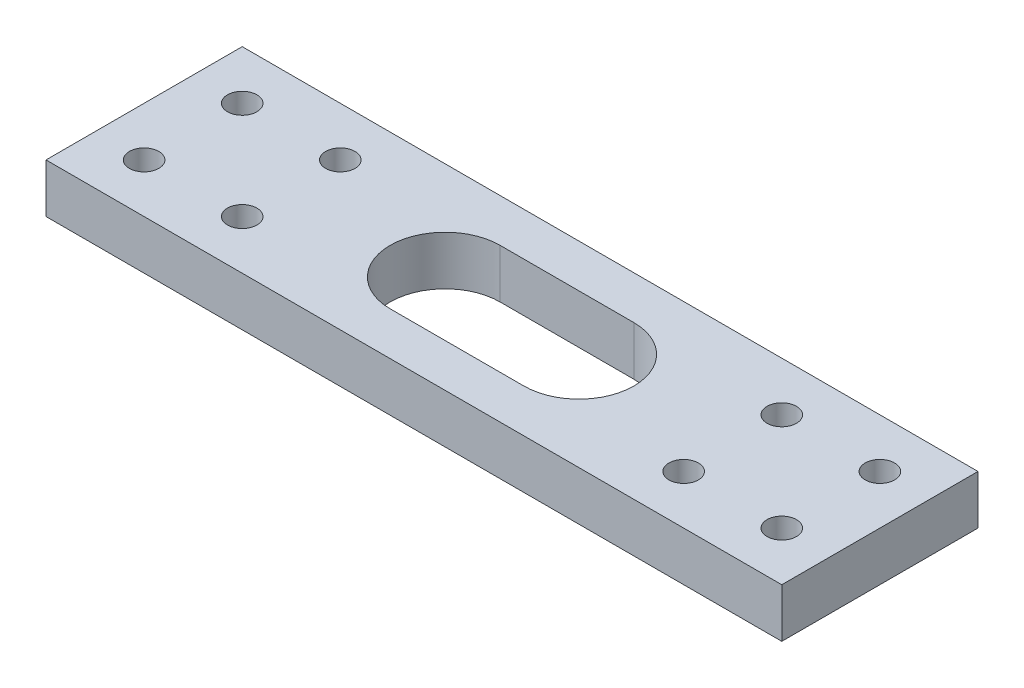
ISO-10303-21;
HEADER;
FILE_DESCRIPTION(('STEP AP214'),'2;1');
FILE_NAME('part.step','',(''),(''),'','','');
FILE_SCHEMA(('AUTOMOTIVE_DESIGN { 1 0 10303 214 1 1 1 1 }'));
ENDSEC;
DATA;
#1=APPLICATION_CONTEXT('core data for automotive mechanical design processes');
#2=APPLICATION_PROTOCOL_DEFINITION('international standard','automotive_design',2000,#1);
#3=PRODUCT_CONTEXT('',#1,'mechanical');
#4=PRODUCT('Part','Part','',(#3));
#5=PRODUCT_RELATED_PRODUCT_CATEGORY('part','',(#4));
#6=PRODUCT_DEFINITION_FORMATION('','',#4);
#7=PRODUCT_DEFINITION_CONTEXT('part definition',#1,'design');
#8=PRODUCT_DEFINITION('design','',#6,#7);
#9=PRODUCT_DEFINITION_SHAPE('','',#8);
#10=(LENGTH_UNIT() NAMED_UNIT(*) SI_UNIT(.MILLI.,.METRE.));
#11=(NAMED_UNIT(*) PLANE_ANGLE_UNIT() SI_UNIT($,.RADIAN.));
#12=(NAMED_UNIT(*) SI_UNIT($,.STERADIAN.) SOLID_ANGLE_UNIT());
#13=UNCERTAINTY_MEASURE_WITH_UNIT(LENGTH_MEASURE(1.E-05),#10,'distance_accuracy_value','');
#14=(GEOMETRIC_REPRESENTATION_CONTEXT(3) GLOBAL_UNCERTAINTY_ASSIGNED_CONTEXT((#13)) GLOBAL_UNIT_ASSIGNED_CONTEXT((#10,
#11,#12)) REPRESENTATION_CONTEXT('',''));
#15=CARTESIAN_POINT('',(0.,0.,0.));
#16=DIRECTION('',(0.,0.,1.));
#17=DIRECTION('',(1.,0.,0.));
#18=AXIS2_PLACEMENT_3D('',#15,#16,#17);
#19=CARTESIAN_POINT('',(37.5,5.,10.));
#20=DIRECTION('',(-1.,0.,0.));
#21=DIRECTION('',(0.,0.,1.));
#22=AXIS2_PLACEMENT_3D('',#19,#20,#21);
#23=PLANE('',#22);
#24=DIRECTION('',(0.,0.,-1.));
#25=VECTOR('',#24,1.);
#26=CARTESIAN_POINT('',(37.5,0.,10.));
#27=LINE('',#26,#25);
#28=CARTESIAN_POINT('',(37.5,0.,10.));
#29=VERTEX_POINT('',#28);
#30=CARTESIAN_POINT('',(37.5,0.,-10.));
#31=VERTEX_POINT('',#30);
#32=EDGE_CURVE('E185',#29,#31,#27,.T.);
#33=ORIENTED_EDGE('',*,*,#32,.T.);
#34=DIRECTION('',(0.,-1.,0.));
#35=VECTOR('',#34,1.);
#36=CARTESIAN_POINT('',(37.5,5.,-10.));
#37=LINE('',#36,#35);
#38=CARTESIAN_POINT('',(37.5,5.,-10.));
#39=VERTEX_POINT('',#38);
#40=EDGE_CURVE('E11',#39,#31,#37,.T.);
#41=ORIENTED_EDGE('',*,*,#40,.F.);
#42=DIRECTION('',(0.,0.,-1.));
#43=VECTOR('',#42,1.);
#44=CARTESIAN_POINT('',(37.5,5.,10.));
#45=LINE('',#44,#43);
#46=CARTESIAN_POINT('',(37.5,5.,10.));
#47=VERTEX_POINT('',#46);
#48=EDGE_CURVE('E189',#47,#39,#45,.T.);
#49=ORIENTED_EDGE('',*,*,#48,.F.);
#50=DIRECTION('',(0.,-1.,0.));
#51=VECTOR('',#50,1.);
#52=CARTESIAN_POINT('',(37.5,5.,10.));
#53=LINE('',#52,#51);
#54=EDGE_CURVE('E203',#47,#29,#53,.T.);
#55=ORIENTED_EDGE('',*,*,#54,.T.);
#56=EDGE_LOOP('',(#33,#41,#49,#55));
#57=FACE_BOUND('',#56,.T.);
#58=ADVANCED_FACE('F39',(#57),#23,.F.);
#59=CARTESIAN_POINT('',(-37.5,5.,-10.));
#60=DIRECTION('',(0.,0.,1.));
#61=DIRECTION('',(1.,0.,0.));
#62=AXIS2_PLACEMENT_3D('',#59,#60,#61);
#63=PLANE('',#62);
#64=DIRECTION('',(-1.,0.,0.));
#65=VECTOR('',#64,1.);
#66=CARTESIAN_POINT('',(-37.5,0.,-10.));
#67=LINE('',#66,#65);
#68=CARTESIAN_POINT('',(-37.5,0.,-10.));
#69=VERTEX_POINT('',#68);
#70=EDGE_CURVE('E207',#31,#69,#67,.T.);
#71=ORIENTED_EDGE('',*,*,#70,.T.);
#72=DIRECTION('',(0.,-1.,0.));
#73=VECTOR('',#72,1.);
#74=CARTESIAN_POINT('',(-37.5,5.,-10.));
#75=LINE('',#74,#73);
#76=CARTESIAN_POINT('',(-37.5,5.,-10.));
#77=VERTEX_POINT('',#76);
#78=EDGE_CURVE('E47',#77,#69,#75,.T.);
#79=ORIENTED_EDGE('',*,*,#78,.F.);
#80=DIRECTION('',(-1.,0.,0.));
#81=VECTOR('',#80,1.);
#82=CARTESIAN_POINT('',(-37.5,5.,-10.));
#83=LINE('',#82,#81);
#84=EDGE_CURVE('E193',#39,#77,#83,.T.);
#85=ORIENTED_EDGE('',*,*,#84,.F.);
#86=ORIENTED_EDGE('',*,*,#40,.T.);
#87=EDGE_LOOP('',(#71,#79,#85,#86));
#88=FACE_BOUND('',#87,.T.);
#89=ADVANCED_FACE('F242',(#88),#63,.F.);
#90=CARTESIAN_POINT('',(-37.5,5.,10.));
#91=DIRECTION('',(1.,0.,0.));
#92=DIRECTION('',(0.,0.,-1.));
#93=AXIS2_PLACEMENT_3D('',#90,#91,#92);
#94=PLANE('',#93);
#95=DIRECTION('',(0.,0.,1.));
#96=VECTOR('',#95,1.);
#97=CARTESIAN_POINT('',(-37.5,0.,10.));
#98=LINE('',#97,#96);
#99=CARTESIAN_POINT('',(-37.5,0.,10.));
#100=VERTEX_POINT('',#99);
#101=EDGE_CURVE('E210',#69,#100,#98,.T.);
#102=ORIENTED_EDGE('',*,*,#101,.T.);
#103=DIRECTION('',(0.,-1.,0.));
#104=VECTOR('',#103,1.);
#105=CARTESIAN_POINT('',(-37.5,5.,10.));
#106=LINE('',#105,#104);
#107=CARTESIAN_POINT('',(-37.5,5.,10.));
#108=VERTEX_POINT('',#107);
#109=EDGE_CURVE('E218',#108,#100,#106,.T.);
#110=ORIENTED_EDGE('',*,*,#109,.F.);
#111=DIRECTION('',(0.,0.,1.));
#112=VECTOR('',#111,1.);
#113=CARTESIAN_POINT('',(-37.5,5.,10.));
#114=LINE('',#113,#112);
#115=EDGE_CURVE('E197',#77,#108,#114,.T.);
#116=ORIENTED_EDGE('',*,*,#115,.F.);
#117=ORIENTED_EDGE('',*,*,#78,.T.);
#118=EDGE_LOOP('',(#102,#110,#116,#117));
#119=FACE_BOUND('',#118,.T.);
#120=ADVANCED_FACE('F227',(#119),#94,.F.);
#121=CARTESIAN_POINT('',(-37.5,5.,10.));
#122=DIRECTION('',(0.,0.,-1.));
#123=DIRECTION('',(-1.,0.,0.));
#124=AXIS2_PLACEMENT_3D('',#121,#122,#123);
#125=PLANE('',#124);
#126=DIRECTION('',(1.,0.,0.));
#127=VECTOR('',#126,1.);
#128=CARTESIAN_POINT('',(-37.5,0.,10.));
#129=LINE('',#128,#127);
#130=EDGE_CURVE('E194',#100,#29,#129,.T.);
#131=ORIENTED_EDGE('',*,*,#130,.T.);
#132=ORIENTED_EDGE('',*,*,#54,.F.);
#133=DIRECTION('',(1.,0.,0.));
#134=VECTOR('',#133,1.);
#135=CARTESIAN_POINT('',(-37.5,5.,10.));
#136=LINE('',#135,#134);
#137=EDGE_CURVE('E200',#108,#47,#136,.T.);
#138=ORIENTED_EDGE('',*,*,#137,.F.);
#139=ORIENTED_EDGE('',*,*,#109,.T.);
#140=EDGE_LOOP('',(#131,#132,#138,#139));
#141=FACE_BOUND('',#140,.T.);
#142=ADVANCED_FACE('F235',(#141),#125,.F.);
#143=CARTESIAN_POINT('',(0.,5.,0.));
#144=DIRECTION('',(0.,-1.,0.));
#145=DIRECTION('',(0.,0.,-1.));
#146=AXIS2_PLACEMENT_3D('',#143,#144,#145);
#147=PLANE('',#146);
#148=CARTESIAN_POINT('',(-32.5,5.,-5.));
#149=DIRECTION('',(0.,-1.,0.));
#150=DIRECTION('',(0.,0.,1.));
#151=AXIS2_PLACEMENT_3D('',#148,#149,#150);
#152=CIRCLE('',#151,1.5);
#153=CARTESIAN_POINT('',(-32.5,5.,-3.5));
#154=VERTEX_POINT('',#153);
#155=EDGE_CURVE('E320',#154,#154,#152,.T.);
#156=ORIENTED_EDGE('',*,*,#155,.T.);
#157=EDGE_LOOP('',(#156));
#158=FACE_BOUND('',#157,.T.);
#159=CARTESIAN_POINT('',(-22.5,5.,5.));
#160=DIRECTION('',(0.,-1.,0.));
#161=DIRECTION('',(0.,0.,1.));
#162=AXIS2_PLACEMENT_3D('',#159,#160,#161);
#163=CIRCLE('',#162,1.5);
#164=CARTESIAN_POINT('',(-22.5,5.,6.5));
#165=VERTEX_POINT('',#164);
#166=EDGE_CURVE('E313',#165,#165,#163,.T.);
#167=ORIENTED_EDGE('',*,*,#166,.T.);
#168=EDGE_LOOP('',(#167));
#169=FACE_BOUND('',#168,.T.);
#170=CARTESIAN_POINT('',(-32.5,5.,5.));
#171=DIRECTION('',(0.,-1.,0.));
#172=DIRECTION('',(0.,0.,1.));
#173=AXIS2_PLACEMENT_3D('',#170,#171,#172);
#174=CIRCLE('',#173,1.5);
#175=CARTESIAN_POINT('',(-32.5,5.,6.5));
#176=VERTEX_POINT('',#175);
#177=EDGE_CURVE('E308',#176,#176,#174,.T.);
#178=ORIENTED_EDGE('',*,*,#177,.T.);
#179=EDGE_LOOP('',(#178));
#180=FACE_BOUND('',#179,.T.);
#181=CARTESIAN_POINT('',(-22.5,5.,-5.));
#182=DIRECTION('',(0.,-1.,0.));
#183=DIRECTION('',(0.,0.,1.));
#184=AXIS2_PLACEMENT_3D('',#181,#182,#183);
#185=CIRCLE('',#184,1.5);
#186=CARTESIAN_POINT('',(-22.5,5.,-3.5));
#187=VERTEX_POINT('',#186);
#188=EDGE_CURVE('E132',#187,#187,#185,.T.);
#189=ORIENTED_EDGE('',*,*,#188,.T.);
#190=EDGE_LOOP('',(#189));
#191=FACE_BOUND('',#190,.T.);
#192=DIRECTION('',(-1.,0.,0.));
#193=VECTOR('',#192,1.);
#194=CARTESIAN_POINT('',(6.81829996968935,5.,-5.60229742732441));
#195=LINE('',#194,#193);
#196=CARTESIAN_POINT('',(6.81829996968935,5.,-5.60229742732441));
#197=VERTEX_POINT('',#196);
#198=CARTESIAN_POINT('',(-6.81829996968934,5.,-5.60229742732441));
#199=VERTEX_POINT('',#198);
#200=EDGE_CURVE('E141',#197,#199,#195,.T.);
#201=ORIENTED_EDGE('',*,*,#200,.F.);
#202=CARTESIAN_POINT('',(6.81829996968936,5.,0.));
#203=DIRECTION('',(0.,1.,0.));
#204=DIRECTION('',(0.,0.,1.));
#205=AXIS2_PLACEMENT_3D('',#202,#203,#204);
#206=CIRCLE('',#205,5.60229742732441);
#207=CARTESIAN_POINT('',(6.81829996968936,5.,5.60229742732441));
#208=VERTEX_POINT('',#207);
#209=EDGE_CURVE('E54',#208,#197,#206,.T.);
#210=ORIENTED_EDGE('',*,*,#209,.F.);
#211=DIRECTION('',(1.,0.,0.));
#212=VECTOR('',#211,1.);
#213=CARTESIAN_POINT('',(6.81829996968936,5.,5.60229742732441));
#214=LINE('',#213,#212);
#215=CARTESIAN_POINT('',(-6.81829996968934,5.,5.60229742732441));
#216=VERTEX_POINT('',#215);
#217=EDGE_CURVE('E125',#216,#208,#214,.T.);
#218=ORIENTED_EDGE('',*,*,#217,.F.);
#219=CARTESIAN_POINT('',(-6.81829996968934,5.,0.));
#220=DIRECTION('',(0.,1.,0.));
#221=DIRECTION('',(0.,0.,1.));
#222=AXIS2_PLACEMENT_3D('',#219,#220,#221);
#223=CIRCLE('',#222,5.60229742732441);
#224=EDGE_CURVE('E129',#199,#216,#223,.T.);
#225=ORIENTED_EDGE('',*,*,#224,.F.);
#226=EDGE_LOOP('',(#201,#210,#218,#225));
#227=FACE_BOUND('',#226,.T.);
#228=CARTESIAN_POINT('',(32.5,5.,-5.));
#229=DIRECTION('',(0.,1.,0.));
#230=DIRECTION('',(0.,0.,1.));
#231=AXIS2_PLACEMENT_3D('',#228,#229,#230);
#232=CIRCLE('',#231,1.5);
#233=CARTESIAN_POINT('',(32.5,5.,-3.5));
#234=VERTEX_POINT('',#233);
#235=EDGE_CURVE('E170',#234,#234,#232,.T.);
#236=ORIENTED_EDGE('',*,*,#235,.F.);
#237=EDGE_LOOP('',(#236));
#238=FACE_BOUND('',#237,.T.);
#239=CARTESIAN_POINT('',(22.5,5.,5.));
#240=DIRECTION('',(0.,1.,0.));
#241=DIRECTION('',(0.,0.,1.));
#242=AXIS2_PLACEMENT_3D('',#239,#240,#241);
#243=CIRCLE('',#242,1.5);
#244=CARTESIAN_POINT('',(22.5,5.,6.5));
#245=VERTEX_POINT('',#244);
#246=EDGE_CURVE('E161',#245,#245,#243,.T.);
#247=ORIENTED_EDGE('',*,*,#246,.F.);
#248=EDGE_LOOP('',(#247));
#249=FACE_BOUND('',#248,.T.);
#250=CARTESIAN_POINT('',(32.5,5.,5.));
#251=DIRECTION('',(0.,1.,0.));
#252=DIRECTION('',(0.,0.,1.));
#253=AXIS2_PLACEMENT_3D('',#250,#251,#252);
#254=CIRCLE('',#253,1.5);
#255=CARTESIAN_POINT('',(32.5,5.,6.5));
#256=VERTEX_POINT('',#255);
#257=EDGE_CURVE('E151',#256,#256,#254,.T.);
#258=ORIENTED_EDGE('',*,*,#257,.F.);
#259=EDGE_LOOP('',(#258));
#260=FACE_BOUND('',#259,.T.);
#261=CARTESIAN_POINT('',(22.5,5.,-5.));
#262=DIRECTION('',(0.,1.,0.));
#263=DIRECTION('',(0.,0.,1.));
#264=AXIS2_PLACEMENT_3D('',#261,#262,#263);
#265=CIRCLE('',#264,1.5);
#266=CARTESIAN_POINT('',(22.5,5.,-3.5));
#267=VERTEX_POINT('',#266);
#268=EDGE_CURVE('E169',#267,#267,#265,.T.);
#269=ORIENTED_EDGE('',*,*,#268,.F.);
#270=EDGE_LOOP('',(#269));
#271=FACE_BOUND('',#270,.T.);
#272=ORIENTED_EDGE('',*,*,#48,.T.);
#273=ORIENTED_EDGE('',*,*,#84,.T.);
#274=ORIENTED_EDGE('',*,*,#115,.T.);
#275=ORIENTED_EDGE('',*,*,#137,.T.);
#276=EDGE_LOOP('',(#272,#273,#274,#275));
#277=FACE_BOUND('',#276,.T.);
#278=ADVANCED_FACE('F241',(#158,#169,#180,#191,#227,#238,#249,#260,#271,#277),#147,.F.);
#279=CARTESIAN_POINT('',(0.,0.,0.));
#280=DIRECTION('',(0.,-1.,0.));
#281=DIRECTION('',(0.,0.,-1.));
#282=AXIS2_PLACEMENT_3D('',#279,#280,#281);
#283=PLANE('',#282);
#284=CARTESIAN_POINT('',(-32.5,0.,-5.));
#285=DIRECTION('',(0.,-1.,0.));
#286=DIRECTION('',(0.,0.,1.));
#287=AXIS2_PLACEMENT_3D('',#284,#285,#286);
#288=CIRCLE('',#287,1.5);
#289=CARTESIAN_POINT('',(-32.5,0.,-3.5));
#290=VERTEX_POINT('',#289);
#291=EDGE_CURVE('E316',#290,#290,#288,.T.);
#292=ORIENTED_EDGE('',*,*,#291,.F.);
#293=EDGE_LOOP('',(#292));
#294=FACE_BOUND('',#293,.T.);
#295=CARTESIAN_POINT('',(-22.5,0.,5.));
#296=DIRECTION('',(0.,-1.,0.));
#297=DIRECTION('',(0.,0.,1.));
#298=AXIS2_PLACEMENT_3D('',#295,#296,#297);
#299=CIRCLE('',#298,1.5);
#300=CARTESIAN_POINT('',(-22.5,0.,6.5));
#301=VERTEX_POINT('',#300);
#302=EDGE_CURVE('E324',#301,#301,#299,.T.);
#303=ORIENTED_EDGE('',*,*,#302,.F.);
#304=EDGE_LOOP('',(#303));
#305=FACE_BOUND('',#304,.T.);
#306=CARTESIAN_POINT('',(-32.5,0.,5.));
#307=DIRECTION('',(0.,-1.,0.));
#308=DIRECTION('',(0.,0.,1.));
#309=AXIS2_PLACEMENT_3D('',#306,#307,#308);
#310=CIRCLE('',#309,1.5);
#311=CARTESIAN_POINT('',(-32.5,0.,6.5));
#312=VERTEX_POINT('',#311);
#313=EDGE_CURVE('E305',#312,#312,#310,.T.);
#314=ORIENTED_EDGE('',*,*,#313,.F.);
#315=EDGE_LOOP('',(#314));
#316=FACE_BOUND('',#315,.T.);
#317=CARTESIAN_POINT('',(-22.5,0.,-5.));
#318=DIRECTION('',(0.,-1.,0.));
#319=DIRECTION('',(0.,0.,1.));
#320=AXIS2_PLACEMENT_3D('',#317,#318,#319);
#321=CIRCLE('',#320,1.5);
#322=CARTESIAN_POINT('',(-22.5,0.,-3.5));
#323=VERTEX_POINT('',#322);
#324=EDGE_CURVE('E142',#323,#323,#321,.T.);
#325=ORIENTED_EDGE('',*,*,#324,.F.);
#326=EDGE_LOOP('',(#325));
#327=FACE_BOUND('',#326,.T.);
#328=CARTESIAN_POINT('',(6.81829996968936,0.,0.));
#329=DIRECTION('',(0.,1.,0.));
#330=DIRECTION('',(0.,0.,1.));
#331=AXIS2_PLACEMENT_3D('',#328,#329,#330);
#332=CIRCLE('',#331,5.60229742732441);
#333=CARTESIAN_POINT('',(6.81829996968936,0.,5.60229742732441));
#334=VERTEX_POINT('',#333);
#335=CARTESIAN_POINT('',(6.81829996968935,0.,-5.60229742732441));
#336=VERTEX_POINT('',#335);
#337=EDGE_CURVE('E106',#334,#336,#332,.T.);
#338=ORIENTED_EDGE('',*,*,#337,.T.);
#339=DIRECTION('',(-1.,0.,0.));
#340=VECTOR('',#339,1.);
#341=CARTESIAN_POINT('',(6.81829996968935,0.,-5.60229742732441));
#342=LINE('',#341,#340);
#343=CARTESIAN_POINT('',(-6.81829996968934,0.,-5.60229742732441));
#344=VERTEX_POINT('',#343);
#345=EDGE_CURVE('E116',#336,#344,#342,.T.);
#346=ORIENTED_EDGE('',*,*,#345,.T.);
#347=CARTESIAN_POINT('',(-6.81829996968934,0.,0.));
#348=DIRECTION('',(0.,1.,0.));
#349=DIRECTION('',(0.,0.,1.));
#350=AXIS2_PLACEMENT_3D('',#347,#348,#349);
#351=CIRCLE('',#350,5.60229742732441);
#352=CARTESIAN_POINT('',(-6.81829996968934,0.,5.60229742732441));
#353=VERTEX_POINT('',#352);
#354=EDGE_CURVE('E62',#344,#353,#351,.T.);
#355=ORIENTED_EDGE('',*,*,#354,.T.);
#356=DIRECTION('',(1.,0.,0.));
#357=VECTOR('',#356,1.);
#358=CARTESIAN_POINT('',(6.81829996968936,0.,5.60229742732441));
#359=LINE('',#358,#357);
#360=EDGE_CURVE('E113',#353,#334,#359,.T.);
#361=ORIENTED_EDGE('',*,*,#360,.T.);
#362=EDGE_LOOP('',(#338,#346,#355,#361));
#363=FACE_BOUND('',#362,.T.);
#364=CARTESIAN_POINT('',(32.5,0.,-5.));
#365=DIRECTION('',(0.,1.,0.));
#366=DIRECTION('',(0.,0.,1.));
#367=AXIS2_PLACEMENT_3D('',#364,#365,#366);
#368=CIRCLE('',#367,1.5);
#369=CARTESIAN_POINT('',(32.5,0.,-3.5));
#370=VERTEX_POINT('',#369);
#371=EDGE_CURVE('E165',#370,#370,#368,.T.);
#372=ORIENTED_EDGE('',*,*,#371,.T.);
#373=EDGE_LOOP('',(#372));
#374=FACE_BOUND('',#373,.T.);
#375=CARTESIAN_POINT('',(22.5,0.,5.));
#376=DIRECTION('',(0.,1.,0.));
#377=DIRECTION('',(0.,0.,1.));
#378=AXIS2_PLACEMENT_3D('',#375,#376,#377);
#379=CIRCLE('',#378,1.5);
#380=CARTESIAN_POINT('',(22.5,0.,6.5));
#381=VERTEX_POINT('',#380);
#382=EDGE_CURVE('E174',#381,#381,#379,.T.);
#383=ORIENTED_EDGE('',*,*,#382,.T.);
#384=EDGE_LOOP('',(#383));
#385=FACE_BOUND('',#384,.T.);
#386=CARTESIAN_POINT('',(32.5,0.,5.));
#387=DIRECTION('',(0.,1.,0.));
#388=DIRECTION('',(0.,0.,1.));
#389=AXIS2_PLACEMENT_3D('',#386,#387,#388);
#390=CIRCLE('',#389,1.5);
#391=CARTESIAN_POINT('',(32.5,0.,6.5));
#392=VERTEX_POINT('',#391);
#393=EDGE_CURVE('E157',#392,#392,#390,.T.);
#394=ORIENTED_EDGE('',*,*,#393,.T.);
#395=EDGE_LOOP('',(#394));
#396=FACE_BOUND('',#395,.T.);
#397=CARTESIAN_POINT('',(22.5,0.,-5.));
#398=DIRECTION('',(0.,1.,0.));
#399=DIRECTION('',(0.,0.,1.));
#400=AXIS2_PLACEMENT_3D('',#397,#398,#399);
#401=CIRCLE('',#400,1.5);
#402=CARTESIAN_POINT('',(22.5,0.,-3.5));
#403=VERTEX_POINT('',#402);
#404=EDGE_CURVE('E181',#403,#403,#401,.T.);
#405=ORIENTED_EDGE('',*,*,#404,.T.);
#406=EDGE_LOOP('',(#405));
#407=FACE_BOUND('',#406,.T.);
#408=ORIENTED_EDGE('',*,*,#32,.F.);
#409=ORIENTED_EDGE('',*,*,#130,.F.);
#410=ORIENTED_EDGE('',*,*,#101,.F.);
#411=ORIENTED_EDGE('',*,*,#70,.F.);
#412=EDGE_LOOP('',(#408,#409,#410,#411));
#413=FACE_BOUND('',#412,.T.);
#414=ADVANCED_FACE('F121',(#294,#305,#316,#327,#363,#374,#385,#396,#407,#413),#283,.T.);
#415=CARTESIAN_POINT('',(22.5,0.,-5.));
#416=DIRECTION('',(0.,1.,0.));
#417=DIRECTION('',(0.,0.,1.));
#418=AXIS2_PLACEMENT_3D('',#415,#416,#417);
#419=CYLINDRICAL_SURFACE('',#418,1.5);
#420=ORIENTED_EDGE('',*,*,#404,.F.);
#421=EDGE_LOOP('',(#420));
#422=FACE_BOUND('',#421,.T.);
#423=ORIENTED_EDGE('',*,*,#268,.T.);
#424=EDGE_LOOP('',(#423));
#425=FACE_BOUND('',#424,.T.);
#426=ADVANCED_FACE('F254',(#422,#425),#419,.F.);
#427=CARTESIAN_POINT('',(32.5,0.,5.));
#428=DIRECTION('',(0.,1.,0.));
#429=DIRECTION('',(0.,0.,1.));
#430=AXIS2_PLACEMENT_3D('',#427,#428,#429);
#431=CYLINDRICAL_SURFACE('',#430,1.5);
#432=ORIENTED_EDGE('',*,*,#393,.F.);
#433=EDGE_LOOP('',(#432));
#434=FACE_BOUND('',#433,.T.);
#435=ORIENTED_EDGE('',*,*,#257,.T.);
#436=EDGE_LOOP('',(#435));
#437=FACE_BOUND('',#436,.T.);
#438=ADVANCED_FACE('F261',(#434,#437),#431,.F.);
#439=CARTESIAN_POINT('',(22.5,0.,5.));
#440=DIRECTION('',(0.,1.,0.));
#441=DIRECTION('',(0.,0.,1.));
#442=AXIS2_PLACEMENT_3D('',#439,#440,#441);
#443=CYLINDRICAL_SURFACE('',#442,1.5);
#444=ORIENTED_EDGE('',*,*,#382,.F.);
#445=EDGE_LOOP('',(#444));
#446=FACE_BOUND('',#445,.T.);
#447=ORIENTED_EDGE('',*,*,#246,.T.);
#448=EDGE_LOOP('',(#447));
#449=FACE_BOUND('',#448,.T.);
#450=ADVANCED_FACE('F263',(#446,#449),#443,.F.);
#451=CARTESIAN_POINT('',(32.5,0.,-5.));
#452=DIRECTION('',(0.,1.,0.));
#453=DIRECTION('',(0.,0.,1.));
#454=AXIS2_PLACEMENT_3D('',#451,#452,#453);
#455=CYLINDRICAL_SURFACE('',#454,1.5);
#456=ORIENTED_EDGE('',*,*,#371,.F.);
#457=EDGE_LOOP('',(#456));
#458=FACE_BOUND('',#457,.T.);
#459=ORIENTED_EDGE('',*,*,#235,.T.);
#460=EDGE_LOOP('',(#459));
#461=FACE_BOUND('',#460,.T.);
#462=ADVANCED_FACE('F266',(#458,#461),#455,.F.);
#463=CARTESIAN_POINT('',(6.81829996968936,0.,0.));
#464=DIRECTION('',(0.,1.,0.));
#465=DIRECTION('',(0.,0.,1.));
#466=AXIS2_PLACEMENT_3D('',#463,#464,#465);
#467=CYLINDRICAL_SURFACE('',#466,5.60229742732441);
#468=ORIENTED_EDGE('',*,*,#209,.T.);
#469=DIRECTION('',(0.,1.,0.));
#470=VECTOR('',#469,1.);
#471=CARTESIAN_POINT('',(6.81829996968935,0.,-5.60229742732441));
#472=LINE('',#471,#470);
#473=EDGE_CURVE('E102',#336,#197,#472,.T.);
#474=ORIENTED_EDGE('',*,*,#473,.F.);
#475=ORIENTED_EDGE('',*,*,#337,.F.);
#476=DIRECTION('',(0.,1.,0.));
#477=VECTOR('',#476,1.);
#478=CARTESIAN_POINT('',(6.81829996968936,0.,5.60229742732441));
#479=LINE('',#478,#477);
#480=EDGE_CURVE('E148',#334,#208,#479,.T.);
#481=ORIENTED_EDGE('',*,*,#480,.T.);
#482=EDGE_LOOP('',(#468,#474,#475,#481));
#483=FACE_BOUND('',#482,.T.);
#484=ADVANCED_FACE('F104',(#483),#467,.F.);
#485=CARTESIAN_POINT('',(6.81829996968936,0.,5.60229742732441));
#486=DIRECTION('',(0.,0.,1.));
#487=DIRECTION('',(1.,0.,0.));
#488=AXIS2_PLACEMENT_3D('',#485,#486,#487);
#489=PLANE('',#488);
#490=ORIENTED_EDGE('',*,*,#217,.T.);
#491=ORIENTED_EDGE('',*,*,#480,.F.);
#492=ORIENTED_EDGE('',*,*,#360,.F.);
#493=DIRECTION('',(0.,1.,0.));
#494=VECTOR('',#493,1.);
#495=CARTESIAN_POINT('',(-6.81829996968934,0.,5.60229742732441));
#496=LINE('',#495,#494);
#497=EDGE_CURVE('E152',#353,#216,#496,.T.);
#498=ORIENTED_EDGE('',*,*,#497,.T.);
#499=EDGE_LOOP('',(#490,#491,#492,#498));
#500=FACE_BOUND('',#499,.T.);
#501=ADVANCED_FACE('F276',(#500),#489,.F.);
#502=CARTESIAN_POINT('',(-6.81829996968934,0.,0.));
#503=DIRECTION('',(0.,1.,0.));
#504=DIRECTION('',(0.,0.,1.));
#505=AXIS2_PLACEMENT_3D('',#502,#503,#504);
#506=CYLINDRICAL_SURFACE('',#505,5.60229742732441);
#507=ORIENTED_EDGE('',*,*,#224,.T.);
#508=ORIENTED_EDGE('',*,*,#497,.F.);
#509=ORIENTED_EDGE('',*,*,#354,.F.);
#510=DIRECTION('',(0.,1.,0.));
#511=VECTOR('',#510,1.);
#512=CARTESIAN_POINT('',(-6.81829996968934,0.,-5.60229742732441));
#513=LINE('',#512,#511);
#514=EDGE_CURVE('E112',#344,#199,#513,.T.);
#515=ORIENTED_EDGE('',*,*,#514,.T.);
#516=EDGE_LOOP('',(#507,#508,#509,#515));
#517=FACE_BOUND('',#516,.T.);
#518=ADVANCED_FACE('F280',(#517),#506,.F.);
#519=CARTESIAN_POINT('',(6.81829996968935,0.,-5.60229742732441));
#520=DIRECTION('',(0.,0.,-1.));
#521=DIRECTION('',(-1.,0.,0.));
#522=AXIS2_PLACEMENT_3D('',#519,#520,#521);
#523=PLANE('',#522);
#524=ORIENTED_EDGE('',*,*,#200,.T.);
#525=ORIENTED_EDGE('',*,*,#514,.F.);
#526=ORIENTED_EDGE('',*,*,#345,.F.);
#527=ORIENTED_EDGE('',*,*,#473,.T.);
#528=EDGE_LOOP('',(#524,#525,#526,#527));
#529=FACE_BOUND('',#528,.T.);
#530=ADVANCED_FACE('F117',(#529),#523,.F.);
#531=CARTESIAN_POINT('',(-22.5,0.,-5.));
#532=DIRECTION('',(0.,1.,0.));
#533=DIRECTION('',(0.,0.,1.));
#534=AXIS2_PLACEMENT_3D('',#531,#532,#533);
#535=CYLINDRICAL_SURFACE('',#534,1.5);
#536=ORIENTED_EDGE('',*,*,#324,.T.);
#537=EDGE_LOOP('',(#536));
#538=FACE_BOUND('',#537,.T.);
#539=ORIENTED_EDGE('',*,*,#188,.F.);
#540=EDGE_LOOP('',(#539));
#541=FACE_BOUND('',#540,.T.);
#542=ADVANCED_FACE('F279',(#538,#541),#535,.F.);
#543=CARTESIAN_POINT('',(-32.5,0.,5.));
#544=DIRECTION('',(0.,1.,0.));
#545=DIRECTION('',(0.,0.,1.));
#546=AXIS2_PLACEMENT_3D('',#543,#544,#545);
#547=CYLINDRICAL_SURFACE('',#546,1.5);
#548=ORIENTED_EDGE('',*,*,#313,.T.);
#549=EDGE_LOOP('',(#548));
#550=FACE_BOUND('',#549,.T.);
#551=ORIENTED_EDGE('',*,*,#177,.F.);
#552=EDGE_LOOP('',(#551));
#553=FACE_BOUND('',#552,.T.);
#554=ADVANCED_FACE('F288',(#550,#553),#547,.F.);
#555=CARTESIAN_POINT('',(-22.5,0.,5.));
#556=DIRECTION('',(0.,1.,0.));
#557=DIRECTION('',(0.,0.,1.));
#558=AXIS2_PLACEMENT_3D('',#555,#556,#557);
#559=CYLINDRICAL_SURFACE('',#558,1.5);
#560=ORIENTED_EDGE('',*,*,#302,.T.);
#561=EDGE_LOOP('',(#560));
#562=FACE_BOUND('',#561,.T.);
#563=ORIENTED_EDGE('',*,*,#166,.F.);
#564=EDGE_LOOP('',(#563));
#565=FACE_BOUND('',#564,.T.);
#566=ADVANCED_FACE('F290',(#562,#565),#559,.F.);
#567=CARTESIAN_POINT('',(-32.5,0.,-5.));
#568=DIRECTION('',(0.,1.,0.));
#569=DIRECTION('',(0.,0.,1.));
#570=AXIS2_PLACEMENT_3D('',#567,#568,#569);
#571=CYLINDRICAL_SURFACE('',#570,1.5);
#572=ORIENTED_EDGE('',*,*,#291,.T.);
#573=EDGE_LOOP('',(#572));
#574=FACE_BOUND('',#573,.T.);
#575=ORIENTED_EDGE('',*,*,#155,.F.);
#576=EDGE_LOOP('',(#575));
#577=FACE_BOUND('',#576,.T.);
#578=ADVANCED_FACE('F293',(#574,#577),#571,.F.);
#579=CLOSED_SHELL('',(#58,#89,#120,#142,#278,#414,#426,#438,#450,#462,#484,#501,#518,#530,#542,
#554,#566,#578));
#580=MANIFOLD_SOLID_BREP('B2',#579);
#581=ADVANCED_BREP_SHAPE_REPRESENTATION('',(#18,#580),#14);
#582=SHAPE_DEFINITION_REPRESENTATION(#9,#581);
ENDSEC;
END-ISO-10303-21;
